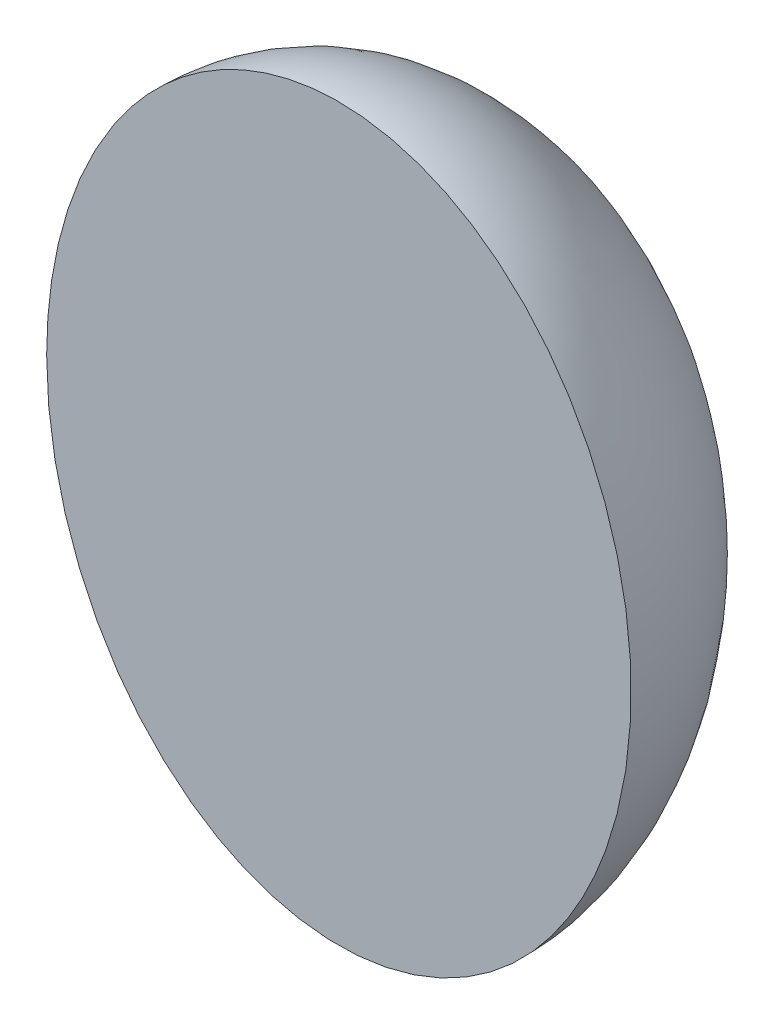
ISO-10303-21;
HEADER;
FILE_DESCRIPTION(('STEP AP214'),'2;1');
FILE_NAME('part.step','',(''),(''),'','','');
FILE_SCHEMA(('AUTOMOTIVE_DESIGN { 1 0 10303 214 1 1 1 1 }'));
ENDSEC;
DATA;
#1=APPLICATION_CONTEXT('core data for automotive mechanical design processes');
#2=APPLICATION_PROTOCOL_DEFINITION('international standard','automotive_design',2000,#1);
#3=PRODUCT_CONTEXT('',#1,'mechanical');
#4=PRODUCT('Part','Part','',(#3));
#5=PRODUCT_RELATED_PRODUCT_CATEGORY('part','',(#4));
#6=PRODUCT_DEFINITION_FORMATION('','',#4);
#7=PRODUCT_DEFINITION_CONTEXT('part definition',#1,'design');
#8=PRODUCT_DEFINITION('design','',#6,#7);
#9=PRODUCT_DEFINITION_SHAPE('','',#8);
#10=(LENGTH_UNIT() NAMED_UNIT(*) SI_UNIT(.MILLI.,.METRE.));
#11=(NAMED_UNIT(*) PLANE_ANGLE_UNIT() SI_UNIT($,.RADIAN.));
#12=(NAMED_UNIT(*) SI_UNIT($,.STERADIAN.) SOLID_ANGLE_UNIT());
#13=UNCERTAINTY_MEASURE_WITH_UNIT(LENGTH_MEASURE(1.E-05),#10,'distance_accuracy_value','');
#14=(GEOMETRIC_REPRESENTATION_CONTEXT(3) GLOBAL_UNCERTAINTY_ASSIGNED_CONTEXT((#13)) GLOBAL_UNIT_ASSIGNED_CONTEXT((#10,
#11,#12)) REPRESENTATION_CONTEXT('',''));
#15=CARTESIAN_POINT('',(0.,0.,0.));
#16=DIRECTION('',(0.,0.,1.));
#17=DIRECTION('',(1.,0.,0.));
#18=AXIS2_PLACEMENT_3D('',#15,#16,#17);
#19=CARTESIAN_POINT('',(0.,0.,0.));
#20=DIRECTION('',(0.,0.,1.));
#21=DIRECTION('',(1.,0.,0.));
#22=AXIS2_PLACEMENT_3D('',#19,#20,#21);
#23=PLANE('',#22);
#24=CARTESIAN_POINT('',(-40.,0.,-2.6628005356244E-13));
#25=CARTESIAN_POINT('',(-39.9999984871524,-1.72750049526673,-4.3858867054766E-13));
#26=CARTESIAN_POINT('',(-39.9283818942151,-3.45551992947665,-1.1751232533138E-13));
#27=CARTESIAN_POINT('',(-39.6414646392131,-6.90060177673713,1.17595918718897E-13));
#28=CARTESIAN_POINT('',(-39.4260618025095,-8.61765552098674,0.));
#29=CARTESIAN_POINT('',(-38.8504259710438,-12.027844209917,0.));
#30=CARTESIAN_POINT('',(-38.4901612549186,-13.7209738316614,0.));
#31=CARTESIAN_POINT('',(-37.6234984235841,-17.0684016586623,0.));
#32=CARTESIAN_POINT('',(-37.1172021737774,-18.7227260659379,0.));
#33=CARTESIAN_POINT('',(-36.0589138032748,-21.6915190082999,0.));
#34=CARTESIAN_POINT('',(-35.5307043870574,-23.0144958137103,0.));
#35=CARTESIAN_POINT('',(-34.3732434276229,-25.6141685994658,0.));
#36=CARTESIAN_POINT('',(-33.7440900525285,-26.8909080819009,0.));
#37=CARTESIAN_POINT('',(-32.3843063468385,-29.3873513667115,0.));
#38=CARTESIAN_POINT('',(-31.6537958396599,-30.6071202760141,0.));
#39=CARTESIAN_POINT('',(-30.0901723890382,-32.9794642384976,0.));
#40=CARTESIAN_POINT('',(-29.2570556001739,-34.1320367709435,0.));
#41=CARTESIAN_POINT('',(-27.6603061031861,-36.140567698509,0.));
#42=CARTESIAN_POINT('',(-26.9144943602611,-37.0107232117301,0.));
#43=CARTESIAN_POINT('',(-25.3575652344762,-38.6904964969656,0.));
#44=CARTESIAN_POINT('',(-24.5464584085491,-39.500124014506,0.));
#45=CARTESIAN_POINT('',(-22.860592040611,-41.0504382094156,0.));
#46=CARTESIAN_POINT('',(-21.9858270039936,-41.791118923092,0.));
#47=CARTESIAN_POINT('',(-20.1754107202322,-43.1944500129417,0.));
#48=CARTESIAN_POINT('',(-19.2397575468086,-43.8570979185752,0.));
#49=CARTESIAN_POINT('',(-17.6276739694625,-44.8921777580077,0.));
#50=CARTESIAN_POINT('',(-16.9665658200704,-45.2886379427715,0.));
#51=CARTESIAN_POINT('',(-15.6205468442622,-46.0390694509942,0.));
#52=CARTESIAN_POINT('',(-14.9356354107929,-46.393039689809,0.));
#53=CARTESIAN_POINT('',(-13.5441667897827,-47.0556499965219,0.));
#54=CARTESIAN_POINT('',(-12.8376086586493,-47.3642880849569,0.));
#55=CARTESIAN_POINT('',(-11.4061135856061,-47.9332880613119,0.));
#56=CARTESIAN_POINT('',(-10.6811960520068,-48.1936986939025,0.));
#57=CARTESIAN_POINT('',(-9.21519814348352,-48.6642312378271,0.));
#58=CARTESIAN_POINT('',(-8.47411811249608,-48.8743542181407,0.));
#59=CARTESIAN_POINT('',(-6.97926458775768,-49.2422295218969,0.));
#60=CARTESIAN_POINT('',(-6.22549393459686,-49.3999934055382,0.));
#61=CARTESIAN_POINT('',(-4.5024852255162,-49.6971294633596,0.));
#62=CARTESIAN_POINT('',(-3.5303247185089,-49.8198712040366,0.));
#63=CARTESIAN_POINT('',(-1.57900788780538,-49.9759729000274,0.));
#64=CARTESIAN_POINT('',(-0.599852394971114,-50.0093432994978,0.));
#65=CARTESIAN_POINT('',(1.35706347821817,-49.9861771589715,0.));
#66=CARTESIAN_POINT('',(2.33482422350475,-49.9296716531072,0.));
#67=CARTESIAN_POINT('',(4.28109750101994,-49.7277852597485,0.));
#68=CARTESIAN_POINT('',(5.24961021214668,-49.582406095018,0.));
#69=CARTESIAN_POINT('',(7.09607877623665,-49.2197118736815,0.));
#70=CARTESIAN_POINT('',(7.97529297193414,-49.0087527966368,0.));
#71=CARTESIAN_POINT('',(9.71358340081082,-48.5161130443756,0.));
#72=CARTESIAN_POINT('',(10.5726610431983,-48.2344373343464,0.));
#73=CARTESIAN_POINT('',(12.265816958816,-47.6040003042162,0.));
#74=CARTESIAN_POINT('',(13.0998941529474,-47.2552360931682,0.));
#75=CARTESIAN_POINT('',(14.7388410489995,-46.4948040932262,0.));
#76=CARTESIAN_POINT('',(15.5437091427388,-46.0831328473078,0.));
#77=CARTESIAN_POINT('',(17.1701948255709,-45.1737454775466,0.));
#78=CARTESIAN_POINT('',(17.9896994252037,-44.6722531426215,0.));
#79=CARTESIAN_POINT('',(19.5884877131011,-43.6089015157844,0.));
#80=CARTESIAN_POINT('',(20.3677701978753,-43.0470404191202,0.));
#81=CARTESIAN_POINT('',(21.8838421835912,-41.8683701676855,0.));
#82=CARTESIAN_POINT('',(22.6206199214521,-41.2515459210416,0.));
#83=CARTESIAN_POINT('',(24.0498350307998,-39.9683392148328,0.));
#84=CARTESIAN_POINT('',(24.7422666699053,-39.3019503722864,0.));
#85=CARTESIAN_POINT('',(25.7994173754808,-38.2148955912748,0.));
#86=CARTESIAN_POINT('',(26.1793649043978,-37.8089056367173,0.));
#87=CARTESIAN_POINT('',(26.9237421518783,-36.9830978314409,0.));
#88=CARTESIAN_POINT('',(27.2881749838788,-36.5632827853712,0.));
#89=CARTESIAN_POINT('',(28.3582371533518,-35.2842147039095,0.));
#90=CARTESIAN_POINT('',(29.0406195437249,-34.4053496889466,0.));
#91=CARTESIAN_POINT('',(30.3428828144196,-32.6021084792078,0.));
#92=CARTESIAN_POINT('',(30.962735696851,-31.6777121708479,0.));
#93=CARTESIAN_POINT('',(32.1396864223237,-29.7898138425317,0.));
#94=CARTESIAN_POINT('',(32.6967813506954,-28.8263100091279,0.));
#95=CARTESIAN_POINT('',(33.8542426045285,-26.6685842879165,0.));
#96=CARTESIAN_POINT('',(34.4407756105674,-25.4669351214446,0.));
#97=CARTESIAN_POINT('',(35.5244607206875,-23.0238131121175,0.));
#98=CARTESIAN_POINT('',(36.0215996390692,-21.7823344261487,0.));
#99=CARTESIAN_POINT('',(36.7009148904882,-19.8961138878458,0.));
#100=CARTESIAN_POINT('',(36.9163509020046,-19.2631498556277,0.));
#101=CARTESIAN_POINT('',(37.3251212782731,-17.9902855675009,0.));
#102=CARTESIAN_POINT('',(37.5184608681137,-17.3503869907339,0.));
#103=CARTESIAN_POINT('',(38.0656099623562,-15.4212228639157,0.));
#104=CARTESIAN_POINT('',(38.3865436325112,-14.1225060820542,0.));
#105=CARTESIAN_POINT('',(38.9928423771154,-11.2642196003617,0.));
#106=CARTESIAN_POINT('',(39.2605921839765,-9.70091355980892,0.));
#107=CARTESIAN_POINT('',(39.6748888886968,-6.55821021696601,0.));
#108=CARTESIAN_POINT('',(39.8214222363237,-4.9788111356802,0.));
#109=CARTESIAN_POINT('',(39.9939000695,-1.8120750822727,0.));
#110=CARTESIAN_POINT('',(40.0197359667821,-0.224732247909333,0.));
#111=CARTESIAN_POINT('',(39.9506042702291,2.9475187246836,0.));
#112=CARTESIAN_POINT('',(39.855634688728,4.53242682242378,0.));
#113=CARTESIAN_POINT('',(39.6145911008552,6.9791939336742,0.));
#114=CARTESIAN_POINT('',(39.5107579030316,7.84541687940216,0.));
#115=CARTESIAN_POINT('',(39.2663406666413,9.57263863041582,0.));
#116=CARTESIAN_POINT('',(39.1257596652698,10.4336378614253,0.));
#117=CARTESIAN_POINT('',(38.8076787698456,12.1488212357455,0.));
#118=CARTESIAN_POINT('',(38.6301780266998,13.0030052218476,0.));
#119=CARTESIAN_POINT('',(38.238010632888,14.7030853848675,0.));
#120=CARTESIAN_POINT('',(38.0233299807864,15.5489783122307,0.));
#121=CARTESIAN_POINT('',(37.3236925572357,18.0695372742679,0.));
#122=CARTESIAN_POINT('',(36.7827776873616,19.7290523737874,0.));
#123=CARTESIAN_POINT('',(35.5498355892948,22.990839382403,0.));
#124=CARTESIAN_POINT('',(34.857853074302,24.5931280665096,0.));
#125=CARTESIAN_POINT('',(33.7999513500114,26.7473730738442,0.));
#126=CARTESIAN_POINT('',(33.4993792455767,27.3319575092375,0.));
#127=CARTESIAN_POINT('',(32.8764852946956,28.4892499100715,0.));
#128=CARTESIAN_POINT('',(32.5541689385369,29.0619608261111,0.));
#129=CARTESIAN_POINT('',(31.5543910777143,30.7608073427151,0.));
#130=CARTESIAN_POINT('',(30.8440200527197,31.867821805844,0.));
#131=CARTESIAN_POINT('',(29.3363862076241,34.0193770742448,0.));
#132=CARTESIAN_POINT('',(28.5392246800777,35.0639885495727,0.));
#133=CARTESIAN_POINT('',(27.2786923287669,36.5763804689445,0.));
#134=CARTESIAN_POINT('',(26.8477282150131,37.0714117684794,0.));
#135=CARTESIAN_POINT('',(25.9641887872415,38.0420588792671,0.));
#136=CARTESIAN_POINT('',(25.5116078462745,38.5176695748352,0.));
#137=CARTESIAN_POINT('',(24.2895754710273,39.7445674697488,0.));
#138=CARTESIAN_POINT('',(23.5021837156449,40.4781383710437,0.));
#139=CARTESIAN_POINT('',(21.872281877537,41.881191249092,0.));
#140=CARTESIAN_POINT('',(21.0297830491554,42.5506862434963,0.));
#141=CARTESIAN_POINT('',(19.7269769768328,43.5010678723742,0.));
#142=CARTESIAN_POINT('',(19.2861469641992,43.8089164743686,0.));
#143=CARTESIAN_POINT('',(18.3919187904551,44.4056954195217,0.));
#144=CARTESIAN_POINT('',(17.9385225961829,44.6946286997397,0.));
#145=CARTESIAN_POINT('',(17.0195989892992,45.252662595125,0.));
#146=CARTESIAN_POINT('',(16.5540699873266,45.521760594075,0.));
#147=CARTESIAN_POINT('',(15.6115893799172,46.0390999498578,0.));
#148=CARTESIAN_POINT('',(15.1346381358459,46.2873419653943,0.));
#149=CARTESIAN_POINT('',(14.0042596611149,46.8435829838015,0.));
#150=CARTESIAN_POINT('',(13.3464902568199,47.1428173082722,0.));
#151=CARTESIAN_POINT('',(12.0135622170569,47.6997145086551,0.));
#152=CARTESIAN_POINT('',(11.3384030956979,47.9573762215104,0.));
#153=CARTESIAN_POINT('',(9.97297317277158,48.4290955466221,0.));
#154=CARTESIAN_POINT('',(9.28270204025656,48.6431522028829,0.));
#155=CARTESIAN_POINT('',(7.89015738727008,49.0257151766041,0.));
#156=CARTESIAN_POINT('',(7.18789263566383,49.194253375451,0.));
#157=CARTESIAN_POINT('',(5.77372856687724,49.4844897113597,0.));
#158=CARTESIAN_POINT('',(5.06182931677296,49.6061881743497,0.));
#159=CARTESIAN_POINT('',(3.63162881406742,49.8016191907783,0.));
#160=CARTESIAN_POINT('',(2.91332866913693,49.8753598859345,0.));
#161=CARTESIAN_POINT('',(1.2534156445457,49.9892863729781,0.));
#162=CARTESIAN_POINT('',(0.31057441535365,50.0123554836086,0.));
#163=CARTESIAN_POINT('',(-1.57330084755433,49.9751868803933,0.));
#164=CARTESIAN_POINT('',(-2.51433505415143,49.9149575788774,0.));
#165=CARTESIAN_POINT('',(-4.38731952128871,49.7122158930565,0.));
#166=CARTESIAN_POINT('',(-5.31927135054619,49.5697179839042,0.));
#167=CARTESIAN_POINT('',(-7.16733742352761,49.2046824929894,0.));
#168=CARTESIAN_POINT('',(-8.08345148419391,48.9821439867412,0.));
#169=CARTESIAN_POINT('',(-9.86037016634834,48.4699308414827,0.));
#170=CARTESIAN_POINT('',(-10.721972062556,48.1830105008538,0.));
#171=CARTESIAN_POINT('',(-12.4196181802235,47.5417479298396,0.));
#172=CARTESIAN_POINT('',(-13.2556633890574,47.1874083080061,0.));
#173=CARTESIAN_POINT('',(-14.8981119913057,46.4155174263695,0.));
#174=CARTESIAN_POINT('',(-15.7045114805266,45.9979578776159,0.));
#175=CARTESIAN_POINT('',(-17.2841229960461,45.1042340158271,0.));
#176=CARTESIAN_POINT('',(-18.0573331521334,44.6280664060728,0.));
#177=CARTESIAN_POINT('',(-19.6378896901469,43.5751477409685,0.));
#178=CARTESIAN_POINT('',(-20.44174914907,42.9931636680277,0.));
#179=CARTESIAN_POINT('',(-22.0038374628093,41.7709592074935,0.));
#180=CARTESIAN_POINT('',(-22.7620640500919,41.1307359299112,0.));
#181=CARTESIAN_POINT('',(-24.2311486331435,39.7978394641713,0.));
#182=CARTESIAN_POINT('',(-24.9419946813354,39.1051531401855,0.));
#183=CARTESIAN_POINT('',(-26.3149986093712,37.6729426822767,0.));
#184=CARTESIAN_POINT('',(-26.9771501427729,36.9334124664028,0.));
#185=CARTESIAN_POINT('',(-27.9886208957096,35.7269297699276,0.));
#186=CARTESIAN_POINT('',(-28.3542225618456,35.2735071609223,0.));
#187=CARTESIAN_POINT('',(-29.0682069962655,34.3534517842902,0.));
#188=CARTESIAN_POINT('',(-29.4165930763766,33.8868215848364,0.));
#189=CARTESIAN_POINT('',(-30.4360562455761,32.4682701701724,0.));
#190=CARTESIAN_POINT('',(-31.0814208400292,31.4977090037454,0.));
#191=CARTESIAN_POINT('',(-32.303740284661,29.5135777368213,0.));
#192=CARTESIAN_POINT('',(-32.8806399472958,28.4999738224483,0.));
#193=CARTESIAN_POINT('',(-33.9658510529135,26.4367318168379,0.));
#194=CARTESIAN_POINT('',(-34.4741603883175,25.3870926195849,0.));
#195=CARTESIAN_POINT('',(-35.5194713297596,23.0402221518588,0.));
#196=CARTESIAN_POINT('',(-36.0411741266596,21.7361620949499,0.));
#197=CARTESIAN_POINT('',(-36.9869517641171,19.0929947080405,0.));
#198=CARTESIAN_POINT('',(-37.4110092394704,17.7538811912325,0.));
#199=CARTESIAN_POINT('',(-38.1620951854827,15.050126960751,0.));
#200=CARTESIAN_POINT('',(-38.4892120221335,13.6855107080123,0.));
#201=CARTESIAN_POINT('',(-39.0477880250788,10.9370660704492,0.));
#202=CARTESIAN_POINT('',(-39.2792674276725,9.55324181403877,0.));
#203=CARTESIAN_POINT('',(-39.5528252545567,7.48695735091982,0.));
#204=CARTESIAN_POINT('',(-39.6311333384306,6.80909849657666,0.));
#205=CARTESIAN_POINT('',(-39.7653133963708,5.45137189739393,0.));
#206=CARTESIAN_POINT('',(-39.8211930825457,4.77150492419868,0.));
#207=CARTESIAN_POINT('',(-39.9105878257835,3.41032643282853,0.));
#208=CARTESIAN_POINT('',(-39.9441037483333,2.72901497157972,0.));
#209=CARTESIAN_POINT('',(-39.9888189576152,1.36516304700555,0.));
#210=CARTESIAN_POINT('',(-40.0000005978019,0.682622038005846,-1.98192281886138E-13));
#211=CARTESIAN_POINT('',(-40.,0.,-2.6628005356244E-13));
#212=B_SPLINE_CURVE_WITH_KNOTS('',3,(#24,#25,#26,#27,#28,#29,#30,#31,#32,#33,#34,#35,#36,#37,
#38,#39,#40,#41,#42,#43,#44,#45,#46,#47,#48,#49,#50,#51,#52,#53,#54,#55,#56,#57,#58,#59,#60,#61,
#62,#63,#64,#65,#66,#67,#68,#69,#70,#71,#72,#73,#74,#75,#76,#77,#78,#79,#80,#81,#82,#83,#84,#85,
#86,#87,#88,#89,#90,#91,#92,#93,#94,#95,#96,#97,#98,#99,#100,#101,#102,#103,#104,#105,#106,#107,
#108,#109,#110,#111,#112,#113,#114,#115,#116,#117,#118,#119,#120,#121,#122,#123,#124,#125,#126,
#127,#128,#129,#130,#131,#132,#133,#134,#135,#136,#137,#138,#139,#140,#141,#142,#143,#144,#145,
#146,#147,#148,#149,#150,#151,#152,#153,#154,#155,#156,#157,#158,#159,#160,#161,#162,#163,#164,
#165,#166,#167,#168,#169,#170,#171,#172,#173,#174,#175,#176,#177,#178,#179,#180,#181,#182,#183,
#184,#185,#186,#187,#188,#189,#190,#191,#192,#193,#194,#195,#196,#197,#198,#199,#200,#201,#202,
#203,#204,#205,#206,#207,#208,#209,#210,#211),.UNSPECIFIED.,.T.,.F.,(4,2,2,2,2,2,2,2,2,2,2,2,2,
2,2,2,2,2,2,2,2,2,2,2,2,2,2,2,2,2,2,2,2,2,2,2,2,2,2,2,2,2,2,2,2,2,2,2,2,2,2,2,2,2,2,2,2,2,2,2,2,
2,2,2,2,2,2,2,2,2,2,2,2,2,2,2,2,2,2,2,2,2,2,2,2,2,2,2,2,2,2,2,2,4),(0.,5.18191161505921,
10.3675094268173,15.5542433821285,20.737368005927,25.0069394258039,29.2723835730558,
33.5328274501565,37.7934310464266,41.2283899698521,44.6627946389981,48.0974960983848,
51.5323062721271,53.8435475699589,56.1548478544892,58.4662490337375,60.7753011190056,
63.0843041157059,65.3927969752875,68.3282220736225,71.2633041159299,74.1973728949906,
77.131384800648,79.8408797298439,82.5501844719687,85.2596059883719,87.969176453249,
90.8486052114587,93.7281200754998,96.6084280524151,99.4891076028568,101.156894095056,
102.824344308467,106.159290415521,109.495723194098,112.8323108629,116.839989733124,
120.848259255155,122.853784005588,124.858833528788,128.868987165113,133.622346829155,
138.376237777709,143.134404852181,147.892650215895,150.509250500345,153.125634591887,
155.742078862601,158.359510600849,163.588389232395,168.815722306798,170.787342953849,
172.758467628857,176.700167130183,180.63731464183,182.605789159752,184.574778902332,
187.800004476718,191.0245734177,192.63722001912,194.249615621475,195.862223515089,
197.474780457847,199.641259001147,201.807798144468,203.974384781803,206.139449970823,
208.304500094252,210.469182564388,213.294718900151,216.119969905042,218.944723958754,
221.769510640015,224.490943575128,227.212271235373,229.933956006371,232.655793942889,
235.630118934542,238.604591600951,241.579811501099,244.555418482212,246.302420513247,
248.049085148024,251.542495768093,255.038703466729,258.535018569093,262.744547340877,
266.954824156352,271.161251215615,275.366787764111,277.413588445498,279.459684720781,
281.505701806699,283.553334833219),.UNSPECIFIED.);
#213=CARTESIAN_POINT('',(-40.,0.,-2.6628005356244E-13));
#214=VERTEX_POINT('',#213);
#215=EDGE_CURVE('E11',#214,#214,#212,.T.);
#216=ORIENTED_EDGE('',*,*,#215,.T.);
#217=EDGE_LOOP('',(#216));
#218=FACE_BOUND('',#217,.T.);
#219=ADVANCED_FACE('F36',(#218),#23,.T.);
#220=CARTESIAN_POINT('',(0.,0.,35.));
#221=CARTESIAN_POINT('',(0.,0.,35.));
#222=CARTESIAN_POINT('',(0.,0.,35.));
#223=CARTESIAN_POINT('',(0.,0.,35.));
#224=CARTESIAN_POINT('',(0.,0.,35.));
#225=CARTESIAN_POINT('',(0.,0.,35.));
#226=CARTESIAN_POINT('',(0.,0.,35.));
#227=CARTESIAN_POINT('',(-80.,0.,35.));
#228=CARTESIAN_POINT('',(-80.,-200.,35.));
#229=CARTESIAN_POINT('',(80.,-200.,35.));
#230=CARTESIAN_POINT('',(80.,0.,35.));
#231=CARTESIAN_POINT('',(80.,200.,35.));
#232=CARTESIAN_POINT('',(-80.,200.,35.));
#233=CARTESIAN_POINT('',(-80.,0.,35.));
#234=CARTESIAN_POINT('',(-80.,0.,-35.));
#235=CARTESIAN_POINT('',(-80.,-200.,-35.));
#236=CARTESIAN_POINT('',(80.,-200.,-35.));
#237=CARTESIAN_POINT('',(80.,0.,-35.));
#238=CARTESIAN_POINT('',(80.,200.,-35.));
#239=CARTESIAN_POINT('',(-80.,200.,-35.));
#240=CARTESIAN_POINT('',(-80.,0.,-35.));
#241=CARTESIAN_POINT('',(0.,0.,-35.));
#242=CARTESIAN_POINT('',(0.,0.,-35.));
#243=CARTESIAN_POINT('',(0.,0.,-35.));
#244=CARTESIAN_POINT('',(0.,0.,-35.));
#245=CARTESIAN_POINT('',(0.,0.,-35.));
#246=CARTESIAN_POINT('',(0.,0.,-35.));
#247=CARTESIAN_POINT('',(0.,0.,-35.));
#248=(BOUNDED_SURFACE() B_SPLINE_SURFACE(3,3,((#220,#221,#222,#223,#224,#225,#226),(#227,#228,
#229,#230,#231,#232,#233),(#234,#235,#236,#237,#238,#239,#240),(#241,#242,#243,#244,#245,#246,
#247)),.UNSPECIFIED.,.F.,.T.,.F.) B_SPLINE_SURFACE_WITH_KNOTS((4,4),(4,3,4),(0.,1.),(0.,0.5,1.),
.UNSPECIFIED.) GEOMETRIC_REPRESENTATION_ITEM() RATIONAL_B_SPLINE_SURFACE(((1.,0.333333333333333,
0.333333333333333,1.,0.333333333333333,0.333333333333333,1.),(0.333333333333333,
0.111111111111111,0.111111111111111,0.333333333333333,0.111111111111111,0.111111111111111,
0.333333333333333),(0.333333333333333,0.111111111111111,0.111111111111111,0.333333333333333,
0.111111111111111,0.111111111111111,0.333333333333333),(1.,0.333333333333333,0.333333333333333,
1.,0.333333333333333,0.333333333333333,1.))) REPRESENTATION_ITEM('') SURFACE());
#249=CARTESIAN_POINT('',(0.,0.,-35.));
#250=VERTEX_POINT('',#249);
#251=VERTEX_LOOP('',#250);
#252=FACE_BOUND('',#251,.T.);
#253=ORIENTED_EDGE('',*,*,#215,.F.);
#254=EDGE_LOOP('',(#253));
#255=FACE_BOUND('',#254,.T.);
#256=ADVANCED_FACE('F38',(#252,#255),#248,.T.);
#257=CLOSED_SHELL('',(#219,#256));
#258=MANIFOLD_SOLID_BREP('B2',#257);
#259=ADVANCED_BREP_SHAPE_REPRESENTATION('',(#18,#258),#14);
#260=SHAPE_DEFINITION_REPRESENTATION(#9,#259);
ENDSEC;
END-ISO-10303-21;
